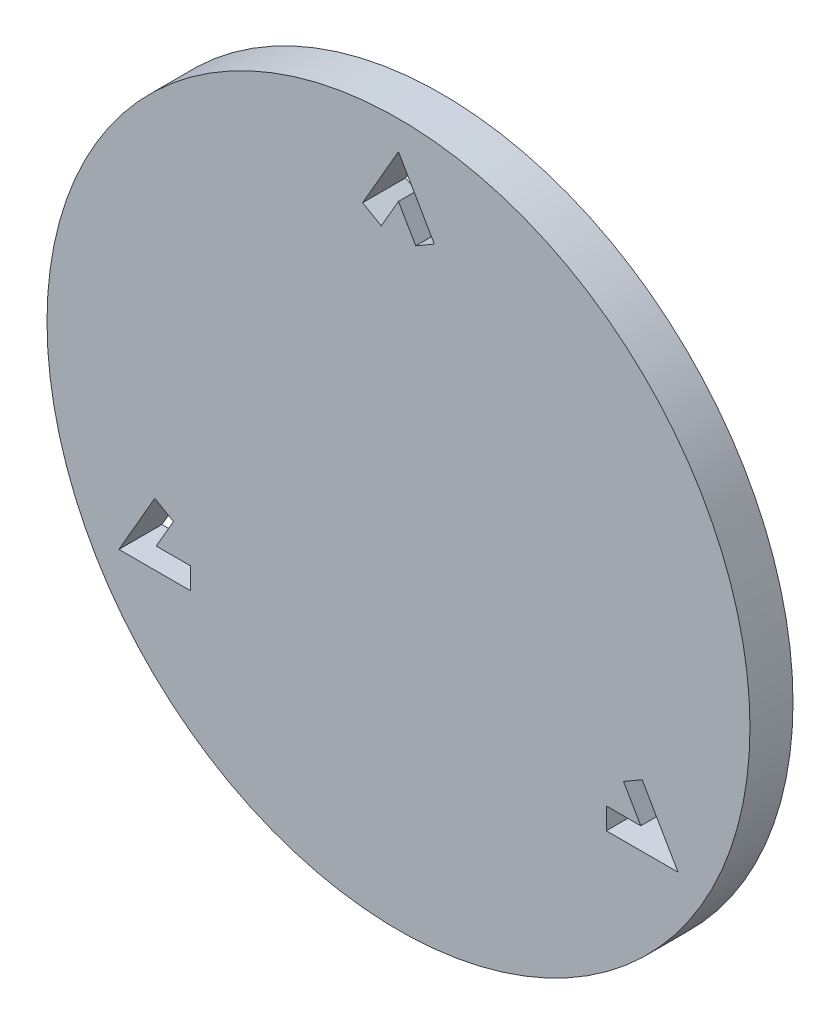
ISO-10303-21;
HEADER;
FILE_DESCRIPTION(('STEP AP214'),'2;1');
FILE_NAME('part.step','',(''),(''),'','','');
FILE_SCHEMA(('AUTOMOTIVE_DESIGN { 1 0 10303 214 1 1 1 1 }'));
ENDSEC;
DATA;
#1=APPLICATION_CONTEXT('core data for automotive mechanical design processes');
#2=APPLICATION_PROTOCOL_DEFINITION('international standard','automotive_design',2000,#1);
#3=PRODUCT_CONTEXT('',#1,'mechanical');
#4=PRODUCT('Part','Part','',(#3));
#5=PRODUCT_RELATED_PRODUCT_CATEGORY('part','',(#4));
#6=PRODUCT_DEFINITION_FORMATION('','',#4);
#7=PRODUCT_DEFINITION_CONTEXT('part definition',#1,'design');
#8=PRODUCT_DEFINITION('design','',#6,#7);
#9=PRODUCT_DEFINITION_SHAPE('','',#8);
#10=(LENGTH_UNIT() NAMED_UNIT(*) SI_UNIT(.MILLI.,.METRE.));
#11=(NAMED_UNIT(*) PLANE_ANGLE_UNIT() SI_UNIT($,.RADIAN.));
#12=(NAMED_UNIT(*) SI_UNIT($,.STERADIAN.) SOLID_ANGLE_UNIT());
#13=UNCERTAINTY_MEASURE_WITH_UNIT(LENGTH_MEASURE(1.E-05),#10,'distance_accuracy_value','');
#14=(GEOMETRIC_REPRESENTATION_CONTEXT(3) GLOBAL_UNCERTAINTY_ASSIGNED_CONTEXT((#13)) GLOBAL_UNIT_ASSIGNED_CONTEXT((#10,
#11,#12)) REPRESENTATION_CONTEXT('',''));
#15=CARTESIAN_POINT('',(0.,0.,0.));
#16=DIRECTION('',(0.,0.,1.));
#17=DIRECTION('',(1.,0.,0.));
#18=AXIS2_PLACEMENT_3D('',#15,#16,#17);
#19=CARTESIAN_POINT('',(-28.9711431702998,0.,6.));
#20=DIRECTION('',(-1.,0.,0.));
#21=DIRECTION('',(0.,0.,1.));
#22=AXIS2_PLACEMENT_3D('',#19,#20,#21);
#23=PLANE('',#22);
#24=DIRECTION('',(0.,1.,0.));
#25=VECTOR('',#24,1.);
#26=CARTESIAN_POINT('',(-28.9711431702998,0.,0.));
#27=LINE('',#26,#25);
#28=CARTESIAN_POINT('',(-28.9711431702998,-22.5,0.));
#29=VERTEX_POINT('',#28);
#30=CARTESIAN_POINT('',(-28.9711431702998,-19.5,0.));
#31=VERTEX_POINT('',#30);
#32=EDGE_CURVE('E246',#29,#31,#27,.T.);
#33=ORIENTED_EDGE('',*,*,#32,.F.);
#34=DIRECTION('',(0.,0.,-1.));
#35=VECTOR('',#34,1.);
#36=CARTESIAN_POINT('',(-28.9711431702998,-22.5,6.));
#37=LINE('',#36,#35);
#38=CARTESIAN_POINT('',(-28.9711431702998,-22.5,6.));
#39=VERTEX_POINT('',#38);
#40=EDGE_CURVE('E11',#39,#29,#37,.T.);
#41=ORIENTED_EDGE('',*,*,#40,.F.);
#42=DIRECTION('',(0.,1.,0.));
#43=VECTOR('',#42,1.);
#44=CARTESIAN_POINT('',(-28.9711431702998,0.,6.));
#45=LINE('',#44,#43);
#46=CARTESIAN_POINT('',(-28.9711431702998,-19.5,6.));
#47=VERTEX_POINT('',#46);
#48=EDGE_CURVE('E279',#39,#47,#45,.T.);
#49=ORIENTED_EDGE('',*,*,#48,.T.);
#50=DIRECTION('',(0.,0.,-1.));
#51=VECTOR('',#50,1.);
#52=CARTESIAN_POINT('',(-28.9711431702998,-19.5,6.));
#53=LINE('',#52,#51);
#54=EDGE_CURVE('E54',#47,#31,#53,.T.);
#55=ORIENTED_EDGE('',*,*,#54,.T.);
#56=EDGE_LOOP('',(#33,#41,#49,#55));
#57=FACE_BOUND('',#56,.T.);
#58=ADVANCED_FACE('F35',(#57),#23,.T.);
#59=CARTESIAN_POINT('',(0.,-22.5,6.));
#60=DIRECTION('',(0.,1.,0.));
#61=DIRECTION('',(-1.,0.,0.));
#62=AXIS2_PLACEMENT_3D('',#59,#60,#61);
#63=PLANE('',#62);
#64=DIRECTION('',(1.,0.,0.));
#65=VECTOR('',#64,1.);
#66=CARTESIAN_POINT('',(0.,-22.5,0.));
#67=LINE('',#66,#65);
#68=CARTESIAN_POINT('',(-38.9711431702998,-22.5,0.));
#69=VERTEX_POINT('',#68);
#70=EDGE_CURVE('E251',#69,#29,#67,.T.);
#71=ORIENTED_EDGE('',*,*,#70,.F.);
#72=DIRECTION('',(0.,0.,-1.));
#73=VECTOR('',#72,1.);
#74=CARTESIAN_POINT('',(-38.9711431702998,-22.5,6.));
#75=LINE('',#74,#73);
#76=CARTESIAN_POINT('',(-38.9711431702998,-22.5,6.));
#77=VERTEX_POINT('',#76);
#78=EDGE_CURVE('E45',#77,#69,#75,.T.);
#79=ORIENTED_EDGE('',*,*,#78,.F.);
#80=DIRECTION('',(1.,0.,0.));
#81=VECTOR('',#80,1.);
#82=CARTESIAN_POINT('',(0.,-22.5,6.));
#83=LINE('',#82,#81);
#84=EDGE_CURVE('E283',#77,#39,#83,.T.);
#85=ORIENTED_EDGE('',*,*,#84,.T.);
#86=ORIENTED_EDGE('',*,*,#40,.T.);
#87=EDGE_LOOP('',(#71,#79,#85,#86));
#88=FACE_BOUND('',#87,.T.);
#89=ADVANCED_FACE('F315',(#88),#63,.T.);
#90=CARTESIAN_POINT('',(-19.4855715851499,11.25,6.));
#91=DIRECTION('',(0.866025403784439,-0.5,0.));
#92=DIRECTION('',(0.5,0.866025403784439,0.));
#93=AXIS2_PLACEMENT_3D('',#90,#91,#92);
#94=PLANE('',#93);
#95=DIRECTION('',(-0.5,-0.866025403784439,0.));
#96=VECTOR('',#95,1.);
#97=CARTESIAN_POINT('',(-19.4855715851499,11.25,0.));
#98=LINE('',#97,#96);
#99=CARTESIAN_POINT('',(-33.9711431702998,-13.8397459621556,0.));
#100=VERTEX_POINT('',#99);
#101=EDGE_CURVE('E263',#100,#69,#98,.T.);
#102=ORIENTED_EDGE('',*,*,#101,.F.);
#103=DIRECTION('',(0.,0.,-1.));
#104=VECTOR('',#103,1.);
#105=CARTESIAN_POINT('',(-33.9711431702998,-13.8397459621556,6.));
#106=LINE('',#105,#104);
#107=CARTESIAN_POINT('',(-33.9711431702998,-13.8397459621556,6.));
#108=VERTEX_POINT('',#107);
#109=EDGE_CURVE('E191',#108,#100,#106,.T.);
#110=ORIENTED_EDGE('',*,*,#109,.F.);
#111=DIRECTION('',(-0.5,-0.866025403784439,0.));
#112=VECTOR('',#111,1.);
#113=CARTESIAN_POINT('',(-19.4855715851499,11.25,6.));
#114=LINE('',#113,#112);
#115=EDGE_CURVE('E185',#108,#77,#114,.T.);
#116=ORIENTED_EDGE('',*,*,#115,.T.);
#117=ORIENTED_EDGE('',*,*,#78,.T.);
#118=EDGE_LOOP('',(#102,#110,#116,#117));
#119=FACE_BOUND('',#118,.T.);
#120=ADVANCED_FACE('F311',(#119),#94,.T.);
#121=CARTESIAN_POINT('',(-14.4855715851499,-25.0897459621556,6.));
#122=DIRECTION('',(0.500000000000001,0.866025403784438,0.));
#123=DIRECTION('',(-0.866025403784438,0.500000000000001,0.));
#124=AXIS2_PLACEMENT_3D('',#121,#122,#123);
#125=PLANE('',#124);
#126=DIRECTION('',(0.866025403784438,-0.500000000000001,0.));
#127=VECTOR('',#126,1.);
#128=CARTESIAN_POINT('',(-14.4855715851499,-25.0897459621556,0.));
#129=LINE('',#128,#127);
#130=CARTESIAN_POINT('',(-31.3730669589464,-15.3397459621556,0.));
#131=VERTEX_POINT('',#130);
#132=EDGE_CURVE('E190',#100,#131,#129,.T.);
#133=ORIENTED_EDGE('',*,*,#132,.T.);
#134=DIRECTION('',(0.,0.,-1.));
#135=VECTOR('',#134,1.);
#136=CARTESIAN_POINT('',(-31.3730669589464,-15.3397459621556,6.));
#137=LINE('',#136,#135);
#138=CARTESIAN_POINT('',(-31.3730669589464,-15.3397459621556,6.));
#139=VERTEX_POINT('',#138);
#140=EDGE_CURVE('E171',#139,#131,#137,.T.);
#141=ORIENTED_EDGE('',*,*,#140,.F.);
#142=DIRECTION('',(0.866025403784438,-0.500000000000001,0.));
#143=VECTOR('',#142,1.);
#144=CARTESIAN_POINT('',(-14.4855715851499,-25.0897459621556,6.));
#145=LINE('',#144,#143);
#146=EDGE_CURVE('E176',#108,#139,#145,.T.);
#147=ORIENTED_EDGE('',*,*,#146,.F.);
#148=ORIENTED_EDGE('',*,*,#109,.T.);
#149=EDGE_LOOP('',(#133,#141,#147,#148));
#150=FACE_BOUND('',#149,.T.);
#151=ADVANCED_FACE('F188',(#150),#125,.F.);
#152=CARTESIAN_POINT('',(-16.8874953737965,9.75,6.));
#153=DIRECTION('',(0.866025403784439,-0.5,0.));
#154=DIRECTION('',(0.5,0.866025403784439,0.));
#155=AXIS2_PLACEMENT_3D('',#152,#153,#154);
#156=PLANE('',#155);
#157=DIRECTION('',(-0.5,-0.866025403784439,0.));
#158=VECTOR('',#157,1.);
#159=CARTESIAN_POINT('',(-16.8874953737965,9.75,0.));
#160=LINE('',#159,#158);
#161=CARTESIAN_POINT('',(-33.7749907475931,-19.5,0.));
#162=VERTEX_POINT('',#161);
#163=EDGE_CURVE('E262',#131,#162,#160,.T.);
#164=ORIENTED_EDGE('',*,*,#163,.T.);
#165=DIRECTION('',(0.,0.,-1.));
#166=VECTOR('',#165,1.);
#167=CARTESIAN_POINT('',(-33.7749907475931,-19.5,6.));
#168=LINE('',#167,#166);
#169=CARTESIAN_POINT('',(-33.7749907475931,-19.5,6.));
#170=VERTEX_POINT('',#169);
#171=EDGE_CURVE('E110',#170,#162,#168,.T.);
#172=ORIENTED_EDGE('',*,*,#171,.F.);
#173=DIRECTION('',(-0.5,-0.866025403784439,0.));
#174=VECTOR('',#173,1.);
#175=CARTESIAN_POINT('',(-16.8874953737965,9.75,6.));
#176=LINE('',#175,#174);
#177=EDGE_CURVE('E167',#139,#170,#176,.T.);
#178=ORIENTED_EDGE('',*,*,#177,.F.);
#179=ORIENTED_EDGE('',*,*,#140,.T.);
#180=EDGE_LOOP('',(#164,#172,#178,#179));
#181=FACE_BOUND('',#180,.T.);
#182=ADVANCED_FACE('F169',(#181),#156,.F.);
#183=CARTESIAN_POINT('',(28.9711431702997,-22.5,0.));
#184=VERTEX_POINT('',#183);
#185=CARTESIAN_POINT('',(38.9711431702997,-22.5,0.));
#186=VERTEX_POINT('',#185);
#187=EDGE_CURVE('E367',#184,#186,#67,.T.);
#188=ORIENTED_EDGE('',*,*,#187,.F.);
#189=DIRECTION('',(0.,0.,-1.));
#190=VECTOR('',#189,1.);
#191=CARTESIAN_POINT('',(28.9711431702997,-22.5,6.));
#192=LINE('',#191,#190);
#193=CARTESIAN_POINT('',(28.9711431702997,-22.5,6.));
#194=VERTEX_POINT('',#193);
#195=EDGE_CURVE('E209',#194,#184,#192,.T.);
#196=ORIENTED_EDGE('',*,*,#195,.F.);
#197=CARTESIAN_POINT('',(38.9711431702997,-22.5,6.));
#198=VERTEX_POINT('',#197);
#199=EDGE_CURVE('E383',#194,#198,#83,.T.);
#200=ORIENTED_EDGE('',*,*,#199,.T.);
#201=DIRECTION('',(0.,0.,-1.));
#202=VECTOR('',#201,1.);
#203=CARTESIAN_POINT('',(38.9711431702997,-22.5,6.));
#204=LINE('',#203,#202);
#205=EDGE_CURVE('E198',#198,#186,#204,.T.);
#206=ORIENTED_EDGE('',*,*,#205,.T.);
#207=EDGE_LOOP('',(#188,#196,#200,#206));
#208=FACE_BOUND('',#207,.T.);
#209=ADVANCED_FACE('F322',(#208),#63,.T.);
#210=CARTESIAN_POINT('',(28.9711431702997,0.,6.));
#211=DIRECTION('',(-1.,0.,0.));
#212=DIRECTION('',(0.,0.,1.));
#213=AXIS2_PLACEMENT_3D('',#210,#211,#212);
#214=PLANE('',#213);
#215=DIRECTION('',(0.,1.,0.));
#216=VECTOR('',#215,1.);
#217=CARTESIAN_POINT('',(28.9711431702997,0.,0.));
#218=LINE('',#217,#216);
#219=CARTESIAN_POINT('',(28.9711431702997,-19.5,0.));
#220=VERTEX_POINT('',#219);
#221=EDGE_CURVE('E369',#184,#220,#218,.T.);
#222=ORIENTED_EDGE('',*,*,#221,.T.);
#223=DIRECTION('',(0.,0.,-1.));
#224=VECTOR('',#223,1.);
#225=CARTESIAN_POINT('',(28.9711431702997,-19.5,6.));
#226=LINE('',#225,#224);
#227=CARTESIAN_POINT('',(28.9711431702997,-19.5,6.));
#228=VERTEX_POINT('',#227);
#229=EDGE_CURVE('E206',#228,#220,#226,.T.);
#230=ORIENTED_EDGE('',*,*,#229,.F.);
#231=DIRECTION('',(0.,1.,0.));
#232=VECTOR('',#231,1.);
#233=CARTESIAN_POINT('',(28.9711431702997,0.,6.));
#234=LINE('',#233,#232);
#235=EDGE_CURVE('E382',#194,#228,#234,.T.);
#236=ORIENTED_EDGE('',*,*,#235,.F.);
#237=ORIENTED_EDGE('',*,*,#195,.T.);
#238=EDGE_LOOP('',(#222,#230,#236,#237));
#239=FACE_BOUND('',#238,.T.);
#240=ADVANCED_FACE('F337',(#239),#214,.F.);
#241=CARTESIAN_POINT('',(0.,-19.5,6.));
#242=DIRECTION('',(0.,1.,0.));
#243=DIRECTION('',(0.,0.,1.));
#244=AXIS2_PLACEMENT_3D('',#241,#242,#243);
#245=PLANE('',#244);
#246=DIRECTION('',(1.,0.,0.));
#247=VECTOR('',#246,1.);
#248=CARTESIAN_POINT('',(0.,-19.5,0.));
#249=LINE('',#248,#247);
#250=CARTESIAN_POINT('',(33.7749907475931,-19.5,0.));
#251=VERTEX_POINT('',#250);
#252=EDGE_CURVE('E257',#220,#251,#249,.T.);
#253=ORIENTED_EDGE('',*,*,#252,.T.);
#254=DIRECTION('',(0.,0.,-1.));
#255=VECTOR('',#254,1.);
#256=CARTESIAN_POINT('',(33.7749907475931,-19.5,6.));
#257=LINE('',#256,#255);
#258=CARTESIAN_POINT('',(33.7749907475931,-19.5,6.));
#259=VERTEX_POINT('',#258);
#260=EDGE_CURVE('E204',#259,#251,#257,.T.);
#261=ORIENTED_EDGE('',*,*,#260,.F.);
#262=DIRECTION('',(1.,0.,0.));
#263=VECTOR('',#262,1.);
#264=CARTESIAN_POINT('',(0.,-19.5,6.));
#265=LINE('',#264,#263);
#266=EDGE_CURVE('E291',#228,#259,#265,.T.);
#267=ORIENTED_EDGE('',*,*,#266,.F.);
#268=ORIENTED_EDGE('',*,*,#229,.T.);
#269=EDGE_LOOP('',(#253,#261,#267,#268));
#270=FACE_BOUND('',#269,.T.);
#271=ADVANCED_FACE('F333',(#270),#245,.F.);
#272=CARTESIAN_POINT('',(16.8874953737965,9.75,6.));
#273=DIRECTION('',(0.866025403784439,0.5,0.));
#274=DIRECTION('',(-0.5,0.866025403784439,0.));
#275=AXIS2_PLACEMENT_3D('',#272,#273,#274);
#276=PLANE('',#275);
#277=DIRECTION('',(0.5,-0.866025403784439,0.));
#278=VECTOR('',#277,1.);
#279=CARTESIAN_POINT('',(16.8874953737965,9.75,0.));
#280=LINE('',#279,#278);
#281=CARTESIAN_POINT('',(31.3730669589464,-15.3397459621556,0.));
#282=VERTEX_POINT('',#281);
#283=EDGE_CURVE('E253',#282,#251,#280,.T.);
#284=ORIENTED_EDGE('',*,*,#283,.F.);
#285=DIRECTION('',(0.,0.,-1.));
#286=VECTOR('',#285,1.);
#287=CARTESIAN_POINT('',(31.3730669589464,-15.3397459621556,6.));
#288=LINE('',#287,#286);
#289=CARTESIAN_POINT('',(31.3730669589464,-15.3397459621556,6.));
#290=VERTEX_POINT('',#289);
#291=EDGE_CURVE('E202',#290,#282,#288,.T.);
#292=ORIENTED_EDGE('',*,*,#291,.F.);
#293=DIRECTION('',(0.5,-0.866025403784439,0.));
#294=VECTOR('',#293,1.);
#295=CARTESIAN_POINT('',(16.8874953737965,9.75,6.));
#296=LINE('',#295,#294);
#297=EDGE_CURVE('E286',#290,#259,#296,.T.);
#298=ORIENTED_EDGE('',*,*,#297,.T.);
#299=ORIENTED_EDGE('',*,*,#260,.T.);
#300=EDGE_LOOP('',(#284,#292,#298,#299));
#301=FACE_BOUND('',#300,.T.);
#302=ADVANCED_FACE('F330',(#301),#276,.T.);
#303=CARTESIAN_POINT('',(14.4855715851499,-25.0897459621556,6.));
#304=DIRECTION('',(0.5,-0.866025403784438,0.));
#305=DIRECTION('',(0.866025403784439,0.5,0.));
#306=AXIS2_PLACEMENT_3D('',#303,#304,#305);
#307=PLANE('',#306);
#308=DIRECTION('',(-0.866025403784439,-0.5,0.));
#309=VECTOR('',#308,1.);
#310=CARTESIAN_POINT('',(14.4855715851499,-25.0897459621556,0.));
#311=LINE('',#310,#309);
#312=CARTESIAN_POINT('',(33.9711431702997,-13.8397459621556,0.));
#313=VERTEX_POINT('',#312);
#314=EDGE_CURVE('E247',#313,#282,#311,.T.);
#315=ORIENTED_EDGE('',*,*,#314,.F.);
#316=DIRECTION('',(0.,0.,-1.));
#317=VECTOR('',#316,1.);
#318=CARTESIAN_POINT('',(33.9711431702997,-13.8397459621556,6.));
#319=LINE('',#318,#317);
#320=CARTESIAN_POINT('',(33.9711431702997,-13.8397459621556,6.));
#321=VERTEX_POINT('',#320);
#322=EDGE_CURVE('E200',#321,#313,#319,.T.);
#323=ORIENTED_EDGE('',*,*,#322,.F.);
#324=DIRECTION('',(-0.866025403784439,-0.5,0.));
#325=VECTOR('',#324,1.);
#326=CARTESIAN_POINT('',(14.4855715851499,-25.0897459621556,6.));
#327=LINE('',#326,#325);
#328=EDGE_CURVE('E280',#321,#290,#327,.T.);
#329=ORIENTED_EDGE('',*,*,#328,.T.);
#330=ORIENTED_EDGE('',*,*,#291,.T.);
#331=EDGE_LOOP('',(#315,#323,#329,#330));
#332=FACE_BOUND('',#331,.T.);
#333=ADVANCED_FACE('F327',(#332),#307,.T.);
#334=CARTESIAN_POINT('',(19.4855715851499,11.25,6.));
#335=DIRECTION('',(-0.866025403784439,-0.5,0.));
#336=DIRECTION('',(0.5,-0.866025403784439,0.));
#337=AXIS2_PLACEMENT_3D('',#334,#335,#336);
#338=PLANE('',#337);
#339=DIRECTION('',(-0.5,0.866025403784439,0.));
#340=VECTOR('',#339,1.);
#341=CARTESIAN_POINT('',(19.4855715851499,11.25,0.));
#342=LINE('',#341,#340);
#343=CARTESIAN_POINT('',(4.99999999999997,36.3397459621557,0.));
#344=VERTEX_POINT('',#343);
#345=CARTESIAN_POINT('',(0.,45.,0.));
#346=VERTEX_POINT('',#345);
#347=EDGE_CURVE('E236',#344,#346,#342,.T.);
#348=ORIENTED_EDGE('',*,*,#347,.F.);
#349=DIRECTION('',(0.,0.,-1.));
#350=VECTOR('',#349,1.);
#351=CARTESIAN_POINT('',(4.99999999999997,36.3397459621557,6.));
#352=LINE('',#351,#350);
#353=CARTESIAN_POINT('',(4.99999999999997,36.3397459621557,6.));
#354=VERTEX_POINT('',#353);
#355=EDGE_CURVE('E39',#354,#344,#352,.T.);
#356=ORIENTED_EDGE('',*,*,#355,.F.);
#357=DIRECTION('',(-0.5,0.866025403784439,0.));
#358=VECTOR('',#357,1.);
#359=CARTESIAN_POINT('',(19.4855715851499,11.25,6.));
#360=LINE('',#359,#358);
#361=CARTESIAN_POINT('',(0.,45.,6.));
#362=VERTEX_POINT('',#361);
#363=EDGE_CURVE('E270',#354,#362,#360,.T.);
#364=ORIENTED_EDGE('',*,*,#363,.T.);
#365=DIRECTION('',(0.,0.,-1.));
#366=VECTOR('',#365,1.);
#367=CARTESIAN_POINT('',(0.,45.,6.));
#368=LINE('',#367,#366);
#369=EDGE_CURVE('E211',#362,#346,#368,.T.);
#370=ORIENTED_EDGE('',*,*,#369,.T.);
#371=EDGE_LOOP('',(#348,#356,#364,#370));
#372=FACE_BOUND('',#371,.T.);
#373=ADVANCED_FACE('F241',(#372),#338,.T.);
#374=CARTESIAN_POINT('',(-14.4855715851499,25.0897459621557,6.));
#375=DIRECTION('',(0.499999999999999,-0.866025403784439,0.));
#376=DIRECTION('',(0.866025403784439,0.499999999999999,0.));
#377=AXIS2_PLACEMENT_3D('',#374,#375,#376);
#378=PLANE('',#377);
#379=DIRECTION('',(-0.866025403784439,-0.499999999999999,0.));
#380=VECTOR('',#379,1.);
#381=CARTESIAN_POINT('',(-14.4855715851499,25.0897459621557,0.));
#382=LINE('',#381,#380);
#383=CARTESIAN_POINT('',(2.40192378864667,34.8397459621556,0.));
#384=VERTEX_POINT('',#383);
#385=EDGE_CURVE('E228',#344,#384,#382,.T.);
#386=ORIENTED_EDGE('',*,*,#385,.T.);
#387=DIRECTION('',(0.,0.,-1.));
#388=VECTOR('',#387,1.);
#389=CARTESIAN_POINT('',(2.40192378864667,34.8397459621556,6.));
#390=LINE('',#389,#388);
#391=CARTESIAN_POINT('',(2.40192378864667,34.8397459621556,6.));
#392=VERTEX_POINT('',#391);
#393=EDGE_CURVE('E219',#392,#384,#390,.T.);
#394=ORIENTED_EDGE('',*,*,#393,.F.);
#395=DIRECTION('',(-0.866025403784439,-0.499999999999999,0.));
#396=VECTOR('',#395,1.);
#397=CARTESIAN_POINT('',(-14.4855715851499,25.0897459621557,6.));
#398=LINE('',#397,#396);
#399=EDGE_CURVE('E229',#354,#392,#398,.T.);
#400=ORIENTED_EDGE('',*,*,#399,.F.);
#401=ORIENTED_EDGE('',*,*,#355,.T.);
#402=EDGE_LOOP('',(#386,#394,#400,#401));
#403=FACE_BOUND('',#402,.T.);
#404=ADVANCED_FACE('F37',(#403),#378,.F.);
#405=CARTESIAN_POINT('',(16.8874953737965,9.74999999999996,6.));
#406=DIRECTION('',(-0.866025403784439,-0.499999999999999,0.));
#407=DIRECTION('',(0.499999999999999,-0.866025403784439,0.));
#408=AXIS2_PLACEMENT_3D('',#405,#406,#407);
#409=PLANE('',#408);
#410=DIRECTION('',(-0.499999999999999,0.866025403784439,0.));
#411=VECTOR('',#410,1.);
#412=CARTESIAN_POINT('',(16.8874953737965,9.74999999999996,0.));
#413=LINE('',#412,#411);
#414=CARTESIAN_POINT('',(0.,39.,0.));
#415=VERTEX_POINT('',#414);
#416=EDGE_CURVE('E239',#384,#415,#413,.T.);
#417=ORIENTED_EDGE('',*,*,#416,.T.);
#418=DIRECTION('',(0.,0.,-1.));
#419=VECTOR('',#418,1.);
#420=CARTESIAN_POINT('',(0.,39.,6.));
#421=LINE('',#420,#419);
#422=CARTESIAN_POINT('',(0.,39.,6.));
#423=VERTEX_POINT('',#422);
#424=EDGE_CURVE('E218',#423,#415,#421,.T.);
#425=ORIENTED_EDGE('',*,*,#424,.F.);
#426=DIRECTION('',(-0.499999999999999,0.866025403784439,0.));
#427=VECTOR('',#426,1.);
#428=CARTESIAN_POINT('',(16.8874953737965,9.74999999999996,6.));
#429=LINE('',#428,#427);
#430=EDGE_CURVE('E276',#392,#423,#429,.T.);
#431=ORIENTED_EDGE('',*,*,#430,.F.);
#432=ORIENTED_EDGE('',*,*,#393,.T.);
#433=EDGE_LOOP('',(#417,#425,#431,#432));
#434=FACE_BOUND('',#433,.T.);
#435=ADVANCED_FACE('F348',(#434),#409,.F.);
#436=CARTESIAN_POINT('',(-16.8874953737966,9.75000000000004,6.));
#437=DIRECTION('',(-0.866025403784438,0.500000000000001,0.));
#438=DIRECTION('',(-0.500000000000001,-0.866025403784438,0.));
#439=AXIS2_PLACEMENT_3D('',#436,#437,#438);
#440=PLANE('',#439);
#441=DIRECTION('',(0.500000000000001,0.866025403784438,0.));
#442=VECTOR('',#441,1.);
#443=CARTESIAN_POINT('',(-16.8874953737966,9.75000000000004,0.));
#444=LINE('',#443,#442);
#445=CARTESIAN_POINT('',(-2.40192378864669,34.8397459621556,0.));
#446=VERTEX_POINT('',#445);
#447=EDGE_CURVE('E356',#446,#415,#444,.T.);
#448=ORIENTED_EDGE('',*,*,#447,.F.);
#449=DIRECTION('',(0.,0.,-1.));
#450=VECTOR('',#449,1.);
#451=CARTESIAN_POINT('',(-2.40192378864669,34.8397459621556,6.));
#452=LINE('',#451,#450);
#453=CARTESIAN_POINT('',(-2.40192378864669,34.8397459621556,6.));
#454=VERTEX_POINT('',#453);
#455=EDGE_CURVE('E216',#454,#446,#452,.T.);
#456=ORIENTED_EDGE('',*,*,#455,.F.);
#457=DIRECTION('',(0.500000000000001,0.866025403784438,0.));
#458=VECTOR('',#457,1.);
#459=CARTESIAN_POINT('',(-16.8874953737966,9.75000000000004,6.));
#460=LINE('',#459,#458);
#461=EDGE_CURVE('E394',#454,#423,#460,.T.);
#462=ORIENTED_EDGE('',*,*,#461,.T.);
#463=ORIENTED_EDGE('',*,*,#424,.T.);
#464=EDGE_LOOP('',(#448,#456,#462,#463));
#465=FACE_BOUND('',#464,.T.);
#466=ADVANCED_FACE('F345',(#465),#440,.T.);
#467=CARTESIAN_POINT('',(14.4855715851499,25.0897459621556,6.));
#468=DIRECTION('',(0.5,0.866025403784439,0.));
#469=DIRECTION('',(-0.866025403784439,0.5,0.));
#470=AXIS2_PLACEMENT_3D('',#467,#468,#469);
#471=PLANE('',#470);
#472=DIRECTION('',(0.866025403784439,-0.5,0.));
#473=VECTOR('',#472,1.);
#474=CARTESIAN_POINT('',(14.4855715851499,25.0897459621556,0.));
#475=LINE('',#474,#473);
#476=CARTESIAN_POINT('',(-5.,36.3397459621556,0.));
#477=VERTEX_POINT('',#476);
#478=EDGE_CURVE('E361',#477,#446,#475,.T.);
#479=ORIENTED_EDGE('',*,*,#478,.F.);
#480=DIRECTION('',(0.,0.,-1.));
#481=VECTOR('',#480,1.);
#482=CARTESIAN_POINT('',(-5.,36.3397459621556,6.));
#483=LINE('',#482,#481);
#484=CARTESIAN_POINT('',(-5.,36.3397459621556,6.));
#485=VERTEX_POINT('',#484);
#486=EDGE_CURVE('E213',#485,#477,#483,.T.);
#487=ORIENTED_EDGE('',*,*,#486,.F.);
#488=DIRECTION('',(0.866025403784439,-0.5,0.));
#489=VECTOR('',#488,1.);
#490=CARTESIAN_POINT('',(14.4855715851499,25.0897459621556,6.));
#491=LINE('',#490,#489);
#492=EDGE_CURVE('E391',#485,#454,#491,.T.);
#493=ORIENTED_EDGE('',*,*,#492,.T.);
#494=ORIENTED_EDGE('',*,*,#455,.T.);
#495=EDGE_LOOP('',(#479,#487,#493,#494));
#496=FACE_BOUND('',#495,.T.);
#497=ADVANCED_FACE('F342',(#496),#471,.T.);
#498=CARTESIAN_POINT('',(0.,-19.5,6.));
#499=DIRECTION('',(0.,-1.,0.));
#500=DIRECTION('',(0.,0.,-1.));
#501=AXIS2_PLACEMENT_3D('',#498,#499,#500);
#502=PLANE('',#501);
#503=DIRECTION('',(-1.,0.,0.));
#504=VECTOR('',#503,1.);
#505=CARTESIAN_POINT('',(0.,-19.5,0.));
#506=LINE('',#505,#504);
#507=EDGE_CURVE('E265',#31,#162,#506,.T.);
#508=ORIENTED_EDGE('',*,*,#507,.F.);
#509=ORIENTED_EDGE('',*,*,#54,.F.);
#510=DIRECTION('',(-1.,0.,0.));
#511=VECTOR('',#510,1.);
#512=CARTESIAN_POINT('',(0.,-19.5,6.));
#513=LINE('',#512,#511);
#514=EDGE_CURVE('E175',#47,#170,#513,.T.);
#515=ORIENTED_EDGE('',*,*,#514,.T.);
#516=ORIENTED_EDGE('',*,*,#171,.T.);
#517=EDGE_LOOP('',(#508,#509,#515,#516));
#518=FACE_BOUND('',#517,.T.);
#519=ADVANCED_FACE('F326',(#518),#502,.T.);
#520=EDGE_CURVE('E243',#186,#313,#342,.T.);
#521=ORIENTED_EDGE('',*,*,#520,.F.);
#522=ORIENTED_EDGE('',*,*,#205,.F.);
#523=EDGE_CURVE('E274',#198,#321,#360,.T.);
#524=ORIENTED_EDGE('',*,*,#523,.T.);
#525=ORIENTED_EDGE('',*,*,#322,.T.);
#526=EDGE_LOOP('',(#521,#522,#524,#525));
#527=FACE_BOUND('',#526,.T.);
#528=ADVANCED_FACE('F308',(#527),#338,.T.);
#529=EDGE_CURVE('E363',#346,#477,#98,.T.);
#530=ORIENTED_EDGE('',*,*,#529,.F.);
#531=ORIENTED_EDGE('',*,*,#369,.F.);
#532=EDGE_CURVE('E388',#362,#485,#114,.T.);
#533=ORIENTED_EDGE('',*,*,#532,.T.);
#534=ORIENTED_EDGE('',*,*,#486,.T.);
#535=EDGE_LOOP('',(#530,#531,#533,#534));
#536=FACE_BOUND('',#535,.T.);
#537=ADVANCED_FACE('F300',(#536),#94,.T.);
#538=CARTESIAN_POINT('',(0.,0.,6.));
#539=DIRECTION('',(0.,0.,-1.));
#540=DIRECTION('',(-1.,0.,0.));
#541=AXIS2_PLACEMENT_3D('',#538,#539,#540);
#542=CYLINDRICAL_SURFACE('',#541,49.);
#543=CARTESIAN_POINT('',(0.,0.,6.));
#544=DIRECTION('',(0.,0.,1.));
#545=DIRECTION('',(1.,0.,0.));
#546=AXIS2_PLACEMENT_3D('',#543,#544,#545);
#547=CIRCLE('',#546,49.);
#548=CARTESIAN_POINT('',(49.,0.,6.));
#549=VERTEX_POINT('',#548);
#550=EDGE_CURVE('E214',#549,#549,#547,.T.);
#551=ORIENTED_EDGE('',*,*,#550,.F.);
#552=EDGE_LOOP('',(#551));
#553=FACE_BOUND('',#552,.T.);
#554=CARTESIAN_POINT('',(0.,0.,0.));
#555=DIRECTION('',(0.,0.,1.));
#556=DIRECTION('',(1.,0.,0.));
#557=AXIS2_PLACEMENT_3D('',#554,#555,#556);
#558=CIRCLE('',#557,49.);
#559=CARTESIAN_POINT('',(49.,0.,0.));
#560=VERTEX_POINT('',#559);
#561=EDGE_CURVE('E268',#560,#560,#558,.T.);
#562=ORIENTED_EDGE('',*,*,#561,.T.);
#563=EDGE_LOOP('',(#562));
#564=FACE_BOUND('',#563,.T.);
#565=ADVANCED_FACE('F298',(#553,#564),#542,.T.);
#566=CARTESIAN_POINT('',(0.,0.,6.));
#567=DIRECTION('',(0.,0.,1.));
#568=DIRECTION('',(1.,0.,0.));
#569=AXIS2_PLACEMENT_3D('',#566,#567,#568);
#570=PLANE('',#569);
#571=ORIENTED_EDGE('',*,*,#363,.F.);
#572=ORIENTED_EDGE('',*,*,#399,.T.);
#573=ORIENTED_EDGE('',*,*,#430,.T.);
#574=ORIENTED_EDGE('',*,*,#461,.F.);
#575=ORIENTED_EDGE('',*,*,#492,.F.);
#576=ORIENTED_EDGE('',*,*,#532,.F.);
#577=EDGE_LOOP('',(#571,#572,#573,#574,#575,#576));
#578=FACE_BOUND('',#577,.T.);
#579=ORIENTED_EDGE('',*,*,#199,.F.);
#580=ORIENTED_EDGE('',*,*,#235,.T.);
#581=ORIENTED_EDGE('',*,*,#266,.T.);
#582=ORIENTED_EDGE('',*,*,#297,.F.);
#583=ORIENTED_EDGE('',*,*,#328,.F.);
#584=ORIENTED_EDGE('',*,*,#523,.F.);
#585=EDGE_LOOP('',(#579,#580,#581,#582,#583,#584));
#586=FACE_BOUND('',#585,.T.);
#587=ORIENTED_EDGE('',*,*,#48,.F.);
#588=ORIENTED_EDGE('',*,*,#84,.F.);
#589=ORIENTED_EDGE('',*,*,#115,.F.);
#590=ORIENTED_EDGE('',*,*,#146,.T.);
#591=ORIENTED_EDGE('',*,*,#177,.T.);
#592=ORIENTED_EDGE('',*,*,#514,.F.);
#593=EDGE_LOOP('',(#587,#588,#589,#590,#591,#592));
#594=FACE_BOUND('',#593,.T.);
#595=ORIENTED_EDGE('',*,*,#550,.T.);
#596=EDGE_LOOP('',(#595));
#597=FACE_BOUND('',#596,.T.);
#598=ADVANCED_FACE('F181',(#578,#586,#594,#597),#570,.T.);
#599=CARTESIAN_POINT('',(0.,0.,0.));
#600=DIRECTION('',(0.,0.,1.));
#601=DIRECTION('',(1.,0.,0.));
#602=AXIS2_PLACEMENT_3D('',#599,#600,#601);
#603=PLANE('',#602);
#604=ORIENTED_EDGE('',*,*,#347,.T.);
#605=ORIENTED_EDGE('',*,*,#529,.T.);
#606=ORIENTED_EDGE('',*,*,#478,.T.);
#607=ORIENTED_EDGE('',*,*,#447,.T.);
#608=ORIENTED_EDGE('',*,*,#416,.F.);
#609=ORIENTED_EDGE('',*,*,#385,.F.);
#610=EDGE_LOOP('',(#604,#605,#606,#607,#608,#609));
#611=FACE_BOUND('',#610,.T.);
#612=ORIENTED_EDGE('',*,*,#187,.T.);
#613=ORIENTED_EDGE('',*,*,#520,.T.);
#614=ORIENTED_EDGE('',*,*,#314,.T.);
#615=ORIENTED_EDGE('',*,*,#283,.T.);
#616=ORIENTED_EDGE('',*,*,#252,.F.);
#617=ORIENTED_EDGE('',*,*,#221,.F.);
#618=EDGE_LOOP('',(#612,#613,#614,#615,#616,#617));
#619=FACE_BOUND('',#618,.T.);
#620=ORIENTED_EDGE('',*,*,#32,.T.);
#621=ORIENTED_EDGE('',*,*,#507,.T.);
#622=ORIENTED_EDGE('',*,*,#163,.F.);
#623=ORIENTED_EDGE('',*,*,#132,.F.);
#624=ORIENTED_EDGE('',*,*,#101,.T.);
#625=ORIENTED_EDGE('',*,*,#70,.T.);
#626=EDGE_LOOP('',(#620,#621,#622,#623,#624,#625));
#627=FACE_BOUND('',#626,.T.);
#628=ORIENTED_EDGE('',*,*,#561,.F.);
#629=EDGE_LOOP('',(#628));
#630=FACE_BOUND('',#629,.T.);
#631=ADVANCED_FACE('F233',(#611,#619,#627,#630),#603,.F.);
#632=CLOSED_SHELL('',(#58,#89,#120,#151,#182,#209,#240,#271,#302,#333,#373,#404,#435,#466,#497,
#519,#528,#537,#565,#598,#631));
#633=MANIFOLD_SOLID_BREP('B2',#632);
#634=ADVANCED_BREP_SHAPE_REPRESENTATION('',(#18,#633),#14);
#635=SHAPE_DEFINITION_REPRESENTATION(#9,#634);
ENDSEC;
END-ISO-10303-21;
